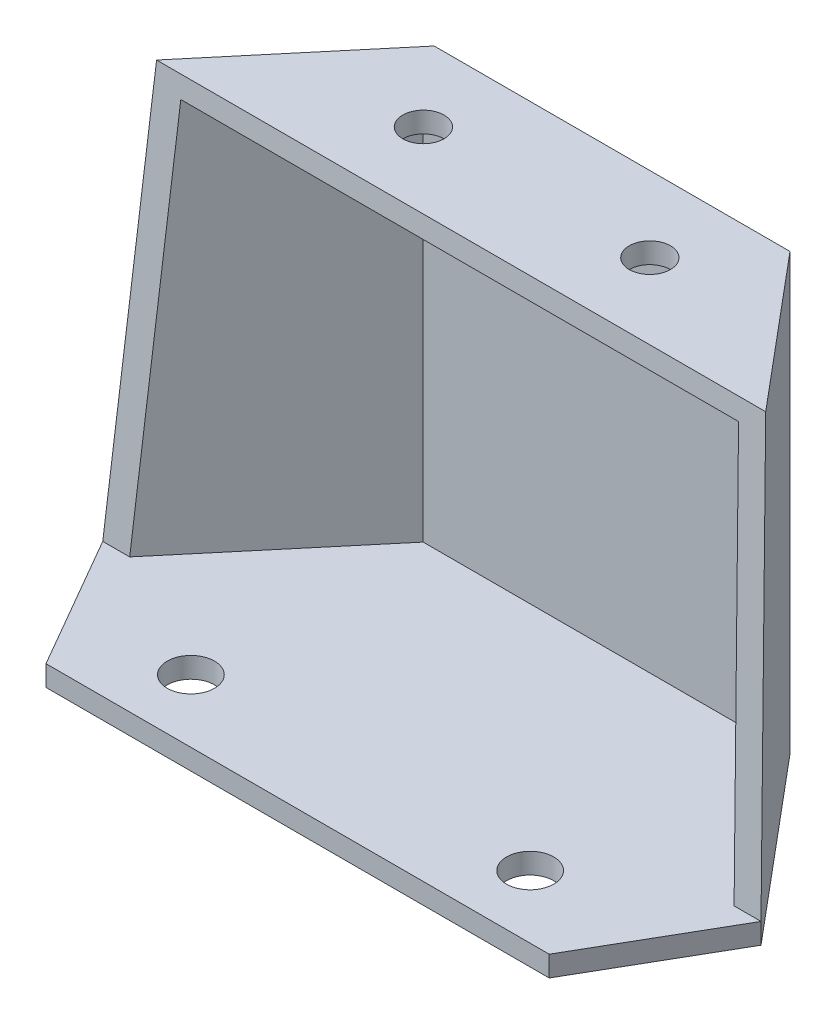
ISO-10303-21;
HEADER;
FILE_DESCRIPTION(('STEP AP214'),'2;1');
FILE_NAME('part.step','',(''),(''),'','','');
FILE_SCHEMA(('AUTOMOTIVE_DESIGN { 1 0 10303 214 1 1 1 1 }'));
ENDSEC;
DATA;
#1=APPLICATION_CONTEXT('core data for automotive mechanical design processes');
#2=APPLICATION_PROTOCOL_DEFINITION('international standard','automotive_design',2000,#1);
#3=PRODUCT_CONTEXT('',#1,'mechanical');
#4=PRODUCT('Part','Part','',(#3));
#5=PRODUCT_RELATED_PRODUCT_CATEGORY('part','',(#4));
#6=PRODUCT_DEFINITION_FORMATION('','',#4);
#7=PRODUCT_DEFINITION_CONTEXT('part definition',#1,'design');
#8=PRODUCT_DEFINITION('design','',#6,#7);
#9=PRODUCT_DEFINITION_SHAPE('','',#8);
#10=(LENGTH_UNIT() NAMED_UNIT(*) SI_UNIT(.MILLI.,.METRE.));
#11=(NAMED_UNIT(*) PLANE_ANGLE_UNIT() SI_UNIT($,.RADIAN.));
#12=(NAMED_UNIT(*) SI_UNIT($,.STERADIAN.) SOLID_ANGLE_UNIT());
#13=UNCERTAINTY_MEASURE_WITH_UNIT(LENGTH_MEASURE(1.E-05),#10,'distance_accuracy_value','');
#14=(GEOMETRIC_REPRESENTATION_CONTEXT(3) GLOBAL_UNCERTAINTY_ASSIGNED_CONTEXT((#13)) GLOBAL_UNIT_ASSIGNED_CONTEXT((#10,
#11,#12)) REPRESENTATION_CONTEXT('',''));
#15=CARTESIAN_POINT('',(0.,0.,0.));
#16=DIRECTION('',(0.,0.,1.));
#17=DIRECTION('',(1.,0.,0.));
#18=AXIS2_PLACEMENT_3D('',#15,#16,#17);
#19=CARTESIAN_POINT('',(-159.592352403094,211.,-65.1118643381918));
#20=DIRECTION('',(0.766044443118977,0.,0.642787609686541));
#21=DIRECTION('',(0.642787609686541,0.,-0.766044443118977));
#22=AXIS2_PLACEMENT_3D('',#19,#20,#21);
#23=PLANE('',#22);
#24=DIRECTION('',(0.,-1.,0.));
#25=VECTOR('',#24,1.);
#26=CARTESIAN_POINT('',(-159.592352403094,211.,-65.1118643381918));
#27=LINE('',#26,#25);
#28=CARTESIAN_POINT('',(-159.592352403094,10.,-65.1118643381918));
#29=VERTEX_POINT('',#28);
#30=CARTESIAN_POINT('',(-159.592352403094,0.,-65.1118643381918));
#31=VERTEX_POINT('',#30);
#32=EDGE_CURVE('E163',#29,#31,#27,.T.);
#33=ORIENTED_EDGE('',*,*,#32,.F.);
#34=DIRECTION('',(0.0589802795117459,0.995781425892182,-0.0702899600003336));
#35=VECTOR('',#34,1.);
#36=CARTESIAN_POINT('',(-147.787327569917,209.307710278525,-79.1805450937942));
#37=LINE('',#36,#35);
#38=CARTESIAN_POINT('',(-147.687093002177,211.,-79.3));
#39=VERTEX_POINT('',#38);
#40=EDGE_CURVE('E133',#29,#39,#37,.T.);
#41=ORIENTED_EDGE('',*,*,#40,.T.);
#42=DIRECTION('',(-0.642787609686541,0.,0.766044443118977));
#43=VECTOR('',#42,1.);
#44=CARTESIAN_POINT('',(-159.592352403094,211.,-65.1118643381918));
#45=LINE('',#44,#43);
#46=CARTESIAN_POINT('',(-86.265,211.,-152.5));
#47=VERTEX_POINT('',#46);
#48=EDGE_CURVE('E213',#47,#39,#45,.T.);
#49=ORIENTED_EDGE('',*,*,#48,.F.);
#50=DIRECTION('',(0.,-1.,0.));
#51=VECTOR('',#50,1.);
#52=CARTESIAN_POINT('',(-86.265,211.,-152.5));
#53=LINE('',#52,#51);
#54=CARTESIAN_POINT('',(-86.265,0.,-152.5));
#55=VERTEX_POINT('',#54);
#56=EDGE_CURVE('E158',#47,#55,#53,.T.);
#57=ORIENTED_EDGE('',*,*,#56,.T.);
#58=DIRECTION('',(-0.642787609686541,0.,0.766044443118977));
#59=VECTOR('',#58,1.);
#60=CARTESIAN_POINT('',(-159.592352403094,0.,-65.1118643381918));
#61=LINE('',#60,#59);
#62=EDGE_CURVE('E212',#55,#31,#61,.T.);
#63=ORIENTED_EDGE('',*,*,#62,.T.);
#64=EDGE_LOOP('',(#33,#41,#49,#57,#63));
#65=FACE_BOUND('',#64,.T.);
#66=ADVANCED_FACE('F39',(#65),#23,.F.);
#67=CARTESIAN_POINT('',(-122.,211.,0.));
#68=DIRECTION('',(0.866025403784438,0.,-0.500000000000001));
#69=DIRECTION('',(-0.500000000000001,0.,-0.866025403784438));
#70=AXIS2_PLACEMENT_3D('',#67,#68,#69);
#71=PLANE('',#70);
#72=DIRECTION('',(0.,-1.,0.));
#73=VECTOR('',#72,1.);
#74=CARTESIAN_POINT('',(-122.,211.,0.));
#75=LINE('',#74,#73);
#76=CARTESIAN_POINT('',(-122.,10.,0.));
#77=VERTEX_POINT('',#76);
#78=CARTESIAN_POINT('',(-122.,0.,0.));
#79=VERTEX_POINT('',#78);
#80=EDGE_CURVE('E155',#77,#79,#75,.T.);
#81=ORIENTED_EDGE('',*,*,#80,.F.);
#82=DIRECTION('',(-0.500000000000001,0.,-0.866025403784438));
#83=VECTOR('',#82,1.);
#84=CARTESIAN_POINT('',(-122.,10.,0.));
#85=LINE('',#84,#83);
#86=EDGE_CURVE('E132',#77,#29,#85,.T.);
#87=ORIENTED_EDGE('',*,*,#86,.T.);
#88=ORIENTED_EDGE('',*,*,#32,.T.);
#89=DIRECTION('',(0.500000000000001,0.,0.866025403784438));
#90=VECTOR('',#89,1.);
#91=CARTESIAN_POINT('',(-122.,0.,0.));
#92=LINE('',#91,#90);
#93=EDGE_CURVE('E222',#31,#79,#92,.T.);
#94=ORIENTED_EDGE('',*,*,#93,.T.);
#95=EDGE_LOOP('',(#81,#87,#88,#94));
#96=FACE_BOUND('',#95,.T.);
#97=ADVANCED_FACE('F246',(#96),#71,.F.);
#98=CARTESIAN_POINT('',(122.,211.,0.));
#99=DIRECTION('',(0.,0.,-1.));
#100=DIRECTION('',(-1.,0.,0.));
#101=AXIS2_PLACEMENT_3D('',#98,#99,#100);
#102=PLANE('',#101);
#103=DIRECTION('',(0.,-1.,0.));
#104=VECTOR('',#103,1.);
#105=CARTESIAN_POINT('',(122.,211.,0.));
#106=LINE('',#105,#104);
#107=CARTESIAN_POINT('',(122.,10.,0.));
#108=VERTEX_POINT('',#107);
#109=CARTESIAN_POINT('',(122.,0.,0.));
#110=VERTEX_POINT('',#109);
#111=EDGE_CURVE('E152',#108,#110,#106,.T.);
#112=ORIENTED_EDGE('',*,*,#111,.F.);
#113=DIRECTION('',(1.,0.,0.));
#114=VECTOR('',#113,1.);
#115=CARTESIAN_POINT('',(-159.592352403094,10.,0.));
#116=LINE('',#115,#114);
#117=EDGE_CURVE('E128',#77,#108,#116,.T.);
#118=ORIENTED_EDGE('',*,*,#117,.F.);
#119=ORIENTED_EDGE('',*,*,#80,.T.);
#120=DIRECTION('',(1.,0.,0.));
#121=VECTOR('',#120,1.);
#122=CARTESIAN_POINT('',(122.,0.,0.));
#123=LINE('',#122,#121);
#124=EDGE_CURVE('E225',#79,#110,#123,.T.);
#125=ORIENTED_EDGE('',*,*,#124,.T.);
#126=EDGE_LOOP('',(#112,#118,#119,#125));
#127=FACE_BOUND('',#126,.T.);
#128=ADVANCED_FACE('F266',(#127),#102,.F.);
#129=CARTESIAN_POINT('',(122.,211.,0.));
#130=DIRECTION('',(-0.866025403784438,0.,-0.500000000000001));
#131=DIRECTION('',(-0.500000000000001,0.,0.866025403784438));
#132=AXIS2_PLACEMENT_3D('',#129,#130,#131);
#133=PLANE('',#132);
#134=DIRECTION('',(0.,-1.,0.));
#135=VECTOR('',#134,1.);
#136=CARTESIAN_POINT('',(159.592352403094,211.,-65.1118643381918));
#137=LINE('',#136,#135);
#138=CARTESIAN_POINT('',(159.592352403094,10.,-65.1118643381918));
#139=VERTEX_POINT('',#138);
#140=CARTESIAN_POINT('',(159.592352403094,0.,-65.1118643381918));
#141=VERTEX_POINT('',#140);
#142=EDGE_CURVE('E143',#139,#141,#137,.T.);
#143=ORIENTED_EDGE('',*,*,#142,.F.);
#144=DIRECTION('',(-0.500000000000001,0.,0.866025403784438));
#145=VECTOR('',#144,1.);
#146=CARTESIAN_POINT('',(122.,10.,0.));
#147=LINE('',#146,#145);
#148=EDGE_CURVE('E123',#139,#108,#147,.T.);
#149=ORIENTED_EDGE('',*,*,#148,.T.);
#150=ORIENTED_EDGE('',*,*,#111,.T.);
#151=DIRECTION('',(0.500000000000001,0.,-0.866025403784438));
#152=VECTOR('',#151,1.);
#153=CARTESIAN_POINT('',(122.,0.,0.));
#154=LINE('',#153,#152);
#155=EDGE_CURVE('E150',#110,#141,#154,.T.);
#156=ORIENTED_EDGE('',*,*,#155,.T.);
#157=EDGE_LOOP('',(#143,#149,#150,#156));
#158=FACE_BOUND('',#157,.T.);
#159=ADVANCED_FACE('F148',(#158),#133,.F.);
#160=CARTESIAN_POINT('',(159.592352403094,211.,-65.1118643381918));
#161=DIRECTION('',(-0.766044443118977,0.,0.642787609686541));
#162=DIRECTION('',(0.642787609686541,0.,0.766044443118977));
#163=AXIS2_PLACEMENT_3D('',#160,#161,#162);
#164=PLANE('',#163);
#165=DIRECTION('',(-0.642787609686541,0.,-0.766044443118977));
#166=VECTOR('',#165,1.);
#167=CARTESIAN_POINT('',(159.592352403094,211.,-65.1118643381918));
#168=LINE('',#167,#166);
#169=CARTESIAN_POINT('',(147.687093002177,211.,-79.3));
#170=VERTEX_POINT('',#169);
#171=CARTESIAN_POINT('',(86.265,211.,-152.5));
#172=VERTEX_POINT('',#171);
#173=EDGE_CURVE('E146',#170,#172,#168,.T.);
#174=ORIENTED_EDGE('',*,*,#173,.F.);
#175=DIRECTION('',(0.0589802795117459,-0.995781425892182,0.0702899600003336));
#176=VECTOR('',#175,1.);
#177=CARTESIAN_POINT('',(147.787327569917,209.307710278525,-79.1805450937942));
#178=LINE('',#177,#176);
#179=EDGE_CURVE('E56',#170,#139,#178,.T.);
#180=ORIENTED_EDGE('',*,*,#179,.T.);
#181=ORIENTED_EDGE('',*,*,#142,.T.);
#182=DIRECTION('',(-0.642787609686541,0.,-0.766044443118977));
#183=VECTOR('',#182,1.);
#184=CARTESIAN_POINT('',(159.592352403094,0.,-65.1118643381918));
#185=LINE('',#184,#183);
#186=CARTESIAN_POINT('',(86.265,0.,-152.5));
#187=VERTEX_POINT('',#186);
#188=EDGE_CURVE('E229',#141,#187,#185,.T.);
#189=ORIENTED_EDGE('',*,*,#188,.T.);
#190=DIRECTION('',(0.,-1.,0.));
#191=VECTOR('',#190,1.);
#192=CARTESIAN_POINT('',(86.265,211.,-152.5));
#193=LINE('',#192,#191);
#194=EDGE_CURVE('E153',#172,#187,#193,.T.);
#195=ORIENTED_EDGE('',*,*,#194,.F.);
#196=EDGE_LOOP('',(#174,#180,#181,#189,#195));
#197=FACE_BOUND('',#196,.T.);
#198=ADVANCED_FACE('F142',(#197),#164,.F.);
#199=CARTESIAN_POINT('',(-86.265,211.,-152.5));
#200=DIRECTION('',(0.,0.,1.));
#201=DIRECTION('',(1.,0.,0.));
#202=AXIS2_PLACEMENT_3D('',#199,#200,#201);
#203=PLANE('',#202);
#204=DIRECTION('',(-1.,0.,0.));
#205=VECTOR('',#204,1.);
#206=CARTESIAN_POINT('',(-86.265,0.,-152.5));
#207=LINE('',#206,#205);
#208=EDGE_CURVE('E216',#187,#55,#207,.T.);
#209=ORIENTED_EDGE('',*,*,#208,.T.);
#210=ORIENTED_EDGE('',*,*,#56,.F.);
#211=DIRECTION('',(-1.,0.,0.));
#212=VECTOR('',#211,1.);
#213=CARTESIAN_POINT('',(-86.265,211.,-152.5));
#214=LINE('',#213,#212);
#215=EDGE_CURVE('E218',#172,#47,#214,.T.);
#216=ORIENTED_EDGE('',*,*,#215,.F.);
#217=ORIENTED_EDGE('',*,*,#194,.T.);
#218=EDGE_LOOP('',(#209,#210,#216,#217));
#219=FACE_BOUND('',#218,.T.);
#220=ADVANCED_FACE('F250',(#219),#203,.F.);
#221=CARTESIAN_POINT('',(0.,211.,0.));
#222=DIRECTION('',(0.,1.,0.));
#223=DIRECTION('',(0.,0.,1.));
#224=AXIS2_PLACEMENT_3D('',#221,#222,#223);
#225=PLANE('',#224);
#226=CARTESIAN_POINT('',(-54.9,211.,-115.9));
#227=DIRECTION('',(0.,1.,0.));
#228=DIRECTION('',(0.,0.,1.));
#229=AXIS2_PLACEMENT_3D('',#226,#227,#228);
#230=CIRCLE('',#229,9.99999999999999);
#231=CARTESIAN_POINT('',(-54.9,211.,-125.9));
#232=VERTEX_POINT('',#231);
#233=EDGE_CURVE('E198',#232,#232,#230,.F.);
#234=ORIENTED_EDGE('',*,*,#233,.T.);
#235=EDGE_LOOP('',(#234));
#236=FACE_BOUND('',#235,.T.);
#237=CARTESIAN_POINT('',(54.9,211.,-115.9));
#238=DIRECTION('',(0.,1.,0.));
#239=DIRECTION('',(0.,0.,1.));
#240=AXIS2_PLACEMENT_3D('',#237,#238,#239);
#241=CIRCLE('',#240,9.99999999999999);
#242=CARTESIAN_POINT('',(54.9,211.,-125.9));
#243=VERTEX_POINT('',#242);
#244=EDGE_CURVE('E182',#243,#243,#241,.F.);
#245=ORIENTED_EDGE('',*,*,#244,.T.);
#246=EDGE_LOOP('',(#245));
#247=FACE_BOUND('',#246,.T.);
#248=DIRECTION('',(1.,0.,0.));
#249=VECTOR('',#248,1.);
#250=CARTESIAN_POINT('',(-159.592352403094,211.,-79.3));
#251=LINE('',#250,#249);
#252=EDGE_CURVE('E201',#39,#170,#251,.T.);
#253=ORIENTED_EDGE('',*,*,#252,.T.);
#254=ORIENTED_EDGE('',*,*,#173,.T.);
#255=ORIENTED_EDGE('',*,*,#215,.T.);
#256=ORIENTED_EDGE('',*,*,#48,.T.);
#257=EDGE_LOOP('',(#253,#254,#255,#256));
#258=FACE_BOUND('',#257,.T.);
#259=ADVANCED_FACE('F249',(#236,#247,#258),#225,.T.);
#260=CARTESIAN_POINT('',(0.,0.,0.));
#261=DIRECTION('',(0.,1.,0.));
#262=DIRECTION('',(0.,0.,1.));
#263=AXIS2_PLACEMENT_3D('',#260,#261,#262);
#264=PLANE('',#263);
#265=CARTESIAN_POINT('',(-82.25,0.,-30.5));
#266=DIRECTION('',(0.,1.,0.));
#267=DIRECTION('',(0.,0.,1.));
#268=AXIS2_PLACEMENT_3D('',#265,#266,#267);
#269=CIRCLE('',#268,11.4510023672373);
#270=CARTESIAN_POINT('',(-82.25,0.,-19.0489976327627));
#271=VERTEX_POINT('',#270);
#272=EDGE_CURVE('E183',#271,#271,#269,.T.);
#273=ORIENTED_EDGE('',*,*,#272,.T.);
#274=EDGE_LOOP('',(#273));
#275=FACE_BOUND('',#274,.T.);
#276=CARTESIAN_POINT('',(82.25,0.,-30.5));
#277=DIRECTION('',(0.,1.,0.));
#278=DIRECTION('',(0.,0.,1.));
#279=AXIS2_PLACEMENT_3D('',#276,#277,#278);
#280=CIRCLE('',#279,11.4510023672373);
#281=CARTESIAN_POINT('',(82.25,0.,-19.0489976327627));
#282=VERTEX_POINT('',#281);
#283=EDGE_CURVE('E189',#282,#282,#280,.T.);
#284=ORIENTED_EDGE('',*,*,#283,.T.);
#285=EDGE_LOOP('',(#284));
#286=FACE_BOUND('',#285,.T.);
#287=ORIENTED_EDGE('',*,*,#62,.F.);
#288=ORIENTED_EDGE('',*,*,#208,.F.);
#289=ORIENTED_EDGE('',*,*,#188,.F.);
#290=ORIENTED_EDGE('',*,*,#155,.F.);
#291=ORIENTED_EDGE('',*,*,#124,.F.);
#292=ORIENTED_EDGE('',*,*,#93,.F.);
#293=EDGE_LOOP('',(#287,#288,#289,#290,#291,#292));
#294=FACE_BOUND('',#293,.T.);
#295=ADVANCED_FACE('F242',(#275,#286,#294),#264,.F.);
#296=CARTESIAN_POINT('',(-159.592352403094,211.,-79.3));
#297=DIRECTION('',(0.,-0.0704125378053743,-0.997517956991154));
#298=DIRECTION('',(0.,0.997517956991155,-0.0704125378053743));
#299=AXIS2_PLACEMENT_3D('',#296,#297,#298);
#300=PLANE('',#299);
#301=DIRECTION('',(1.,0.,0.));
#302=VECTOR('',#301,1.);
#303=CARTESIAN_POINT('',(-159.592352403094,10.,-65.1118643381918));
#304=LINE('',#303,#302);
#305=CARTESIAN_POINT('',(-146.538279509771,10.,-65.1118643381918));
#306=VERTEX_POINT('',#305);
#307=EDGE_CURVE('E138',#29,#306,#304,.T.);
#308=ORIENTED_EDGE('',*,*,#307,.T.);
#309=DIRECTION('',(0.0589802795117459,0.995781425892182,-0.0702899600003336));
#310=VECTOR('',#309,1.);
#311=CARTESIAN_POINT('',(-134.778665532355,208.541025429372,-79.1264265432985));
#312=LINE('',#311,#310);
#313=CARTESIAN_POINT('',(-135.225321571586,201.,-78.5941226038901));
#314=VERTEX_POINT('',#313);
#315=EDGE_CURVE('E63',#306,#314,#312,.T.);
#316=ORIENTED_EDGE('',*,*,#315,.T.);
#317=DIRECTION('',(-1.,0.,0.));
#318=VECTOR('',#317,1.);
#319=CARTESIAN_POINT('',(0.,201.,-78.5941226038901));
#320=LINE('',#319,#318);
#321=CARTESIAN_POINT('',(135.225321571586,201.,-78.5941226038901));
#322=VERTEX_POINT('',#321);
#323=EDGE_CURVE('E202',#322,#314,#320,.T.);
#324=ORIENTED_EDGE('',*,*,#323,.F.);
#325=DIRECTION('',(0.0589802795117459,-0.995781425892182,0.0702899600003336));
#326=VECTOR('',#325,1.);
#327=CARTESIAN_POINT('',(134.778665532355,208.541025429372,-79.1264265432985));
#328=LINE('',#327,#326);
#329=CARTESIAN_POINT('',(146.538279509771,10.,-65.1118643381918));
#330=VERTEX_POINT('',#329);
#331=EDGE_CURVE('E137',#322,#330,#328,.T.);
#332=ORIENTED_EDGE('',*,*,#331,.T.);
#333=EDGE_CURVE('E125',#330,#139,#304,.T.);
#334=ORIENTED_EDGE('',*,*,#333,.T.);
#335=ORIENTED_EDGE('',*,*,#179,.F.);
#336=ORIENTED_EDGE('',*,*,#252,.F.);
#337=ORIENTED_EDGE('',*,*,#40,.F.);
#338=EDGE_LOOP('',(#308,#316,#324,#332,#334,#335,#336,#337));
#339=FACE_BOUND('',#338,.T.);
#340=ADVANCED_FACE('F135',(#339),#300,.F.);
#341=CARTESIAN_POINT('',(-151.931907971904,211.,-58.6839882413264));
#342=DIRECTION('',(0.766044443118977,0.,0.642787609686541));
#343=DIRECTION('',(0.642787609686541,0.,-0.766044443118977));
#344=AXIS2_PLACEMENT_3D('',#341,#342,#343);
#345=PLANE('',#344);
#346=ORIENTED_EDGE('',*,*,#315,.F.);
#347=DIRECTION('',(-0.642787609686541,0.,0.766044443118977));
#348=VECTOR('',#347,1.);
#349=CARTESIAN_POINT('',(-151.931907971904,9.99999999999998,-58.6839882413264));
#350=LINE('',#349,#348);
#351=CARTESIAN_POINT('',(-81.60192341845,10.,-142.5));
#352=VERTEX_POINT('',#351);
#353=EDGE_CURVE('E164',#352,#306,#350,.T.);
#354=ORIENTED_EDGE('',*,*,#353,.F.);
#355=DIRECTION('',(0.,-1.,0.));
#356=VECTOR('',#355,1.);
#357=CARTESIAN_POINT('',(-81.60192341845,211.,-142.5));
#358=LINE('',#357,#356);
#359=CARTESIAN_POINT('',(-81.60192341845,201.,-142.5));
#360=VERTEX_POINT('',#359);
#361=EDGE_CURVE('E177',#360,#352,#358,.T.);
#362=ORIENTED_EDGE('',*,*,#361,.F.);
#363=DIRECTION('',(-0.642787609686541,0.,0.766044443118977));
#364=VECTOR('',#363,1.);
#365=CARTESIAN_POINT('',(-151.931907971904,201.,-58.6839882413264));
#366=LINE('',#365,#364);
#367=EDGE_CURVE('E167',#360,#314,#366,.T.);
#368=ORIENTED_EDGE('',*,*,#367,.T.);
#369=EDGE_LOOP('',(#346,#354,#362,#368));
#370=FACE_BOUND('',#369,.T.);
#371=ADVANCED_FACE('F270',(#370),#345,.T.);
#372=CARTESIAN_POINT('',(151.931907971904,211.,-58.6839882413264));
#373=DIRECTION('',(-0.766044443118977,0.,0.642787609686541));
#374=DIRECTION('',(0.642787609686541,0.,0.766044443118977));
#375=AXIS2_PLACEMENT_3D('',#372,#373,#374);
#376=PLANE('',#375);
#377=ORIENTED_EDGE('',*,*,#331,.F.);
#378=DIRECTION('',(-0.642787609686541,0.,-0.766044443118977));
#379=VECTOR('',#378,1.);
#380=CARTESIAN_POINT('',(151.931907971904,201.,-58.6839882413264));
#381=LINE('',#380,#379);
#382=CARTESIAN_POINT('',(81.60192341845,201.,-142.5));
#383=VERTEX_POINT('',#382);
#384=EDGE_CURVE('E48',#322,#383,#381,.T.);
#385=ORIENTED_EDGE('',*,*,#384,.T.);
#386=DIRECTION('',(0.,-1.,0.));
#387=VECTOR('',#386,1.);
#388=CARTESIAN_POINT('',(81.60192341845,211.,-142.5));
#389=LINE('',#388,#387);
#390=CARTESIAN_POINT('',(81.60192341845,10.,-142.5));
#391=VERTEX_POINT('',#390);
#392=EDGE_CURVE('E170',#383,#391,#389,.T.);
#393=ORIENTED_EDGE('',*,*,#392,.T.);
#394=DIRECTION('',(-0.642787609686541,0.,-0.766044443118977));
#395=VECTOR('',#394,1.);
#396=CARTESIAN_POINT('',(151.931907971904,9.99999999999998,-58.6839882413264));
#397=LINE('',#396,#395);
#398=EDGE_CURVE('E175',#330,#391,#397,.T.);
#399=ORIENTED_EDGE('',*,*,#398,.F.);
#400=EDGE_LOOP('',(#377,#385,#393,#399));
#401=FACE_BOUND('',#400,.T.);
#402=ADVANCED_FACE('F273',(#401),#376,.T.);
#403=CARTESIAN_POINT('',(-86.265,211.,-142.5));
#404=DIRECTION('',(0.,0.,1.));
#405=DIRECTION('',(1.,0.,0.));
#406=AXIS2_PLACEMENT_3D('',#403,#404,#405);
#407=PLANE('',#406);
#408=DIRECTION('',(-1.,0.,0.));
#409=VECTOR('',#408,1.);
#410=CARTESIAN_POINT('',(-86.265,10.,-142.5));
#411=LINE('',#410,#409);
#412=EDGE_CURVE('E173',#391,#352,#411,.T.);
#413=ORIENTED_EDGE('',*,*,#412,.F.);
#414=ORIENTED_EDGE('',*,*,#392,.F.);
#415=DIRECTION('',(-1.,0.,0.));
#416=VECTOR('',#415,1.);
#417=CARTESIAN_POINT('',(-86.265,201.,-142.5));
#418=LINE('',#417,#416);
#419=EDGE_CURVE('E11',#383,#360,#418,.T.);
#420=ORIENTED_EDGE('',*,*,#419,.T.);
#421=ORIENTED_EDGE('',*,*,#361,.T.);
#422=EDGE_LOOP('',(#413,#414,#420,#421));
#423=FACE_BOUND('',#422,.T.);
#424=ADVANCED_FACE('F277',(#423),#407,.T.);
#425=CARTESIAN_POINT('',(0.,201.,0.));
#426=DIRECTION('',(0.,1.,0.));
#427=DIRECTION('',(0.,0.,1.));
#428=AXIS2_PLACEMENT_3D('',#425,#426,#427);
#429=PLANE('',#428);
#430=CARTESIAN_POINT('',(-54.9,201.,-115.9));
#431=DIRECTION('',(0.,1.,0.));
#432=DIRECTION('',(0.,0.,1.));
#433=AXIS2_PLACEMENT_3D('',#430,#431,#432);
#434=CIRCLE('',#433,9.99999999999999);
#435=CARTESIAN_POINT('',(-54.9,201.,-125.9));
#436=VERTEX_POINT('',#435);
#437=EDGE_CURVE('E43',#436,#436,#434,.F.);
#438=ORIENTED_EDGE('',*,*,#437,.F.);
#439=EDGE_LOOP('',(#438));
#440=FACE_BOUND('',#439,.T.);
#441=CARTESIAN_POINT('',(54.9,201.,-115.9));
#442=DIRECTION('',(0.,1.,0.));
#443=DIRECTION('',(0.,0.,1.));
#444=AXIS2_PLACEMENT_3D('',#441,#442,#443);
#445=CIRCLE('',#444,9.99999999999999);
#446=CARTESIAN_POINT('',(54.9,201.,-125.9));
#447=VERTEX_POINT('',#446);
#448=EDGE_CURVE('E180',#447,#447,#445,.F.);
#449=ORIENTED_EDGE('',*,*,#448,.F.);
#450=EDGE_LOOP('',(#449));
#451=FACE_BOUND('',#450,.T.);
#452=ORIENTED_EDGE('',*,*,#384,.F.);
#453=ORIENTED_EDGE('',*,*,#323,.T.);
#454=ORIENTED_EDGE('',*,*,#367,.F.);
#455=ORIENTED_EDGE('',*,*,#419,.F.);
#456=EDGE_LOOP('',(#452,#453,#454,#455));
#457=FACE_BOUND('',#456,.T.);
#458=ADVANCED_FACE('F280',(#440,#451,#457),#429,.F.);
#459=CARTESIAN_POINT('',(0.,10.,0.));
#460=DIRECTION('',(0.,1.,0.));
#461=DIRECTION('',(0.,0.,1.));
#462=AXIS2_PLACEMENT_3D('',#459,#460,#461);
#463=PLANE('',#462);
#464=CARTESIAN_POINT('',(-82.25,10.,-30.5));
#465=DIRECTION('',(0.,1.,0.));
#466=DIRECTION('',(0.,0.,1.));
#467=AXIS2_PLACEMENT_3D('',#464,#465,#466);
#468=CIRCLE('',#467,11.4510023672373);
#469=CARTESIAN_POINT('',(-82.25,10.,-19.0489976327627));
#470=VERTEX_POINT('',#469);
#471=EDGE_CURVE('E194',#470,#470,#468,.T.);
#472=ORIENTED_EDGE('',*,*,#471,.F.);
#473=EDGE_LOOP('',(#472));
#474=FACE_BOUND('',#473,.T.);
#475=CARTESIAN_POINT('',(82.25,10.,-30.5));
#476=DIRECTION('',(0.,1.,0.));
#477=DIRECTION('',(0.,0.,1.));
#478=AXIS2_PLACEMENT_3D('',#475,#476,#477);
#479=CIRCLE('',#478,11.4510023672373);
#480=CARTESIAN_POINT('',(82.25,10.,-19.0489976327627));
#481=VERTEX_POINT('',#480);
#482=EDGE_CURVE('E466',#481,#481,#479,.T.);
#483=ORIENTED_EDGE('',*,*,#482,.F.);
#484=EDGE_LOOP('',(#483));
#485=FACE_BOUND('',#484,.T.);
#486=ORIENTED_EDGE('',*,*,#353,.T.);
#487=ORIENTED_EDGE('',*,*,#307,.F.);
#488=ORIENTED_EDGE('',*,*,#86,.F.);
#489=ORIENTED_EDGE('',*,*,#117,.T.);
#490=ORIENTED_EDGE('',*,*,#148,.F.);
#491=ORIENTED_EDGE('',*,*,#333,.F.);
#492=ORIENTED_EDGE('',*,*,#398,.T.);
#493=ORIENTED_EDGE('',*,*,#412,.T.);
#494=EDGE_LOOP('',(#486,#487,#488,#489,#490,#491,#492,#493));
#495=FACE_BOUND('',#494,.T.);
#496=ADVANCED_FACE('F41',(#474,#485,#495),#463,.T.);
#497=CARTESIAN_POINT('',(54.9,211.000012,-115.9));
#498=DIRECTION('',(0.,-1.,0.));
#499=DIRECTION('',(0.,0.,-1.));
#500=AXIS2_PLACEMENT_3D('',#497,#498,#499);
#501=CYLINDRICAL_SURFACE('',#500,9.99999999999999);
#502=CARTESIAN_POINT('',(54.9,211.,-125.9));
#503=CARTESIAN_POINT('',(54.9,210.895833333333,-125.9));
#504=CARTESIAN_POINT('',(54.9,210.791666666667,-125.9));
#505=CARTESIAN_POINT('',(54.9,210.583333333333,-125.9));
#506=CARTESIAN_POINT('',(54.9,210.479166666667,-125.9));
#507=CARTESIAN_POINT('',(54.9,210.270833333333,-125.9));
#508=CARTESIAN_POINT('',(54.9,210.166666666667,-125.9));
#509=CARTESIAN_POINT('',(54.9,209.958333333333,-125.9));
#510=CARTESIAN_POINT('',(54.9,209.854166666667,-125.9));
#511=CARTESIAN_POINT('',(54.9,209.645833333333,-125.9));
#512=CARTESIAN_POINT('',(54.9,209.541666666667,-125.9));
#513=CARTESIAN_POINT('',(54.9,209.333333333333,-125.9));
#514=CARTESIAN_POINT('',(54.9,209.229166666667,-125.9));
#515=CARTESIAN_POINT('',(54.9,209.020833333333,-125.9));
#516=CARTESIAN_POINT('',(54.9,208.916666666667,-125.9));
#517=CARTESIAN_POINT('',(54.9,208.708333333333,-125.9));
#518=CARTESIAN_POINT('',(54.9,208.604166666667,-125.9));
#519=CARTESIAN_POINT('',(54.9,208.395833333333,-125.9));
#520=CARTESIAN_POINT('',(54.9,208.291666666667,-125.9));
#521=CARTESIAN_POINT('',(54.9,208.083333333333,-125.9));
#522=CARTESIAN_POINT('',(54.9,207.979166666667,-125.9));
#523=CARTESIAN_POINT('',(54.9,207.770833333333,-125.9));
#524=CARTESIAN_POINT('',(54.9,207.666666666667,-125.9));
#525=CARTESIAN_POINT('',(54.9,207.458333333333,-125.9));
#526=CARTESIAN_POINT('',(54.9,207.354166666667,-125.9));
#527=CARTESIAN_POINT('',(54.9,207.145833333333,-125.9));
#528=CARTESIAN_POINT('',(54.9,207.041666666667,-125.9));
#529=CARTESIAN_POINT('',(54.9,206.833333333333,-125.9));
#530=CARTESIAN_POINT('',(54.9,206.729166666667,-125.9));
#531=CARTESIAN_POINT('',(54.9,206.520833333333,-125.9));
#532=CARTESIAN_POINT('',(54.9,206.416666666667,-125.9));
#533=CARTESIAN_POINT('',(54.9,206.208333333333,-125.9));
#534=CARTESIAN_POINT('',(54.9,206.104166666667,-125.9));
#535=CARTESIAN_POINT('',(54.9,205.895833333333,-125.9));
#536=CARTESIAN_POINT('',(54.9,205.791666666667,-125.9));
#537=CARTESIAN_POINT('',(54.9,205.583333333333,-125.9));
#538=CARTESIAN_POINT('',(54.9,205.479166666667,-125.9));
#539=CARTESIAN_POINT('',(54.9,205.270833333333,-125.9));
#540=CARTESIAN_POINT('',(54.9,205.166666666667,-125.9));
#541=CARTESIAN_POINT('',(54.9,204.958333333333,-125.9));
#542=CARTESIAN_POINT('',(54.9,204.854166666667,-125.9));
#543=CARTESIAN_POINT('',(54.9,204.645833333333,-125.9));
#544=CARTESIAN_POINT('',(54.9,204.541666666667,-125.9));
#545=CARTESIAN_POINT('',(54.9,204.333333333333,-125.9));
#546=CARTESIAN_POINT('',(54.9,204.229166666667,-125.9));
#547=CARTESIAN_POINT('',(54.9,204.020833333333,-125.9));
#548=CARTESIAN_POINT('',(54.9,203.916666666667,-125.9));
#549=CARTESIAN_POINT('',(54.9,203.708333333333,-125.9));
#550=CARTESIAN_POINT('',(54.9,203.604166666667,-125.9));
#551=CARTESIAN_POINT('',(54.9,203.395833333333,-125.9));
#552=CARTESIAN_POINT('',(54.9,203.291666666667,-125.9));
#553=CARTESIAN_POINT('',(54.9,203.083333333333,-125.9));
#554=CARTESIAN_POINT('',(54.9,202.979166666667,-125.9));
#555=CARTESIAN_POINT('',(54.9,202.770833333333,-125.9));
#556=CARTESIAN_POINT('',(54.9,202.666666666667,-125.9));
#557=CARTESIAN_POINT('',(54.9,202.458333333333,-125.9));
#558=CARTESIAN_POINT('',(54.9,202.354166666667,-125.9));
#559=CARTESIAN_POINT('',(54.9,202.145833333333,-125.9));
#560=CARTESIAN_POINT('',(54.9,202.041666666667,-125.9));
#561=CARTESIAN_POINT('',(54.9,201.833333333333,-125.9));
#562=CARTESIAN_POINT('',(54.9,201.729166666667,-125.9));
#563=CARTESIAN_POINT('',(54.9,201.520833333333,-125.9));
#564=CARTESIAN_POINT('',(54.9,201.416666666667,-125.9));
#565=CARTESIAN_POINT('',(54.9,201.208333333333,-125.9));
#566=CARTESIAN_POINT('',(54.9,201.104166666667,-125.9));
#567=CARTESIAN_POINT('',(54.9,201.,-125.9));
#568=B_SPLINE_CURVE_WITH_KNOTS('',3,(#502,#503,#504,#505,#506,#507,#508,#509,#510,#511,#512,
#513,#514,#515,#516,#517,#518,#519,#520,#521,#522,#523,#524,#525,#526,#527,#528,#529,#530,#531,
#532,#533,#534,#535,#536,#537,#538,#539,#540,#541,#542,#543,#544,#545,#546,#547,#548,#549,#550,
#551,#552,#553,#554,#555,#556,#557,#558,#559,#560,#561,#562,#563,#564,#565,#566,#567),
.UNSPECIFIED.,.F.,.F.,(4,2,2,2,2,2,2,2,2,2,2,2,2,2,2,2,2,2,2,2,2,2,2,2,2,2,2,2,2,2,2,2,4),(0.,
0.312500000000021,0.625000000000014,0.937500000000008,1.25,1.56250000000002,1.87500000000002,
2.18750000000001,2.5,2.81250000000002,3.12500000000002,3.43750000000001,3.75,4.06250000000002,
4.37500000000002,4.68750000000001,5.,5.31250000000003,5.62500000000002,5.93750000000001,
6.25000000000001,6.56250000000003,6.87500000000002,7.18750000000001,7.50000000000001,
7.81250000000003,8.12500000000002,8.43750000000001,8.75000000000001,9.06250000000003,
9.37500000000002,9.68750000000002,10.),.UNSPECIFIED.);
#569=EDGE_CURVE('BSEAM287',#243,#447,#568,.T.);
#570=ORIENTED_EDGE('',*,*,#244,.F.);
#571=ORIENTED_EDGE('',*,*,#448,.T.);
#572=ORIENTED_EDGE('',*,*,#569,.T.);
#573=ORIENTED_EDGE('',*,*,#569,.F.);
#574=EDGE_LOOP('',(#570,#572,#571,#573));
#575=FACE_BOUND('',#574,.T.);
#576=ADVANCED_FACE('F287',(#575),#501,.F.);
#577=CARTESIAN_POINT('',(-54.9,211.000012,-115.9));
#578=DIRECTION('',(0.,-1.,0.));
#579=DIRECTION('',(0.,0.,-1.));
#580=AXIS2_PLACEMENT_3D('',#577,#578,#579);
#581=CYLINDRICAL_SURFACE('',#580,9.99999999999999);
#582=CARTESIAN_POINT('',(-54.9,211.,-125.9));
#583=CARTESIAN_POINT('',(-54.9,210.895833333333,-125.9));
#584=CARTESIAN_POINT('',(-54.9,210.791666666667,-125.9));
#585=CARTESIAN_POINT('',(-54.9,210.583333333333,-125.9));
#586=CARTESIAN_POINT('',(-54.9,210.479166666667,-125.9));
#587=CARTESIAN_POINT('',(-54.9,210.270833333333,-125.9));
#588=CARTESIAN_POINT('',(-54.9,210.166666666667,-125.9));
#589=CARTESIAN_POINT('',(-54.9,209.958333333333,-125.9));
#590=CARTESIAN_POINT('',(-54.9,209.854166666667,-125.9));
#591=CARTESIAN_POINT('',(-54.9,209.645833333333,-125.9));
#592=CARTESIAN_POINT('',(-54.9,209.541666666667,-125.9));
#593=CARTESIAN_POINT('',(-54.9,209.333333333333,-125.9));
#594=CARTESIAN_POINT('',(-54.9,209.229166666667,-125.9));
#595=CARTESIAN_POINT('',(-54.9,209.020833333333,-125.9));
#596=CARTESIAN_POINT('',(-54.9,208.916666666667,-125.9));
#597=CARTESIAN_POINT('',(-54.9,208.708333333333,-125.9));
#598=CARTESIAN_POINT('',(-54.9,208.604166666667,-125.9));
#599=CARTESIAN_POINT('',(-54.9,208.395833333333,-125.9));
#600=CARTESIAN_POINT('',(-54.9,208.291666666667,-125.9));
#601=CARTESIAN_POINT('',(-54.9,208.083333333333,-125.9));
#602=CARTESIAN_POINT('',(-54.9,207.979166666667,-125.9));
#603=CARTESIAN_POINT('',(-54.9,207.770833333333,-125.9));
#604=CARTESIAN_POINT('',(-54.9,207.666666666667,-125.9));
#605=CARTESIAN_POINT('',(-54.9,207.458333333333,-125.9));
#606=CARTESIAN_POINT('',(-54.9,207.354166666667,-125.9));
#607=CARTESIAN_POINT('',(-54.9,207.145833333333,-125.9));
#608=CARTESIAN_POINT('',(-54.9,207.041666666667,-125.9));
#609=CARTESIAN_POINT('',(-54.9,206.833333333333,-125.9));
#610=CARTESIAN_POINT('',(-54.9,206.729166666667,-125.9));
#611=CARTESIAN_POINT('',(-54.9,206.520833333333,-125.9));
#612=CARTESIAN_POINT('',(-54.9,206.416666666667,-125.9));
#613=CARTESIAN_POINT('',(-54.9,206.208333333333,-125.9));
#614=CARTESIAN_POINT('',(-54.9,206.104166666667,-125.9));
#615=CARTESIAN_POINT('',(-54.9,205.895833333333,-125.9));
#616=CARTESIAN_POINT('',(-54.9,205.791666666667,-125.9));
#617=CARTESIAN_POINT('',(-54.9,205.583333333333,-125.9));
#618=CARTESIAN_POINT('',(-54.9,205.479166666667,-125.9));
#619=CARTESIAN_POINT('',(-54.9,205.270833333333,-125.9));
#620=CARTESIAN_POINT('',(-54.9,205.166666666667,-125.9));
#621=CARTESIAN_POINT('',(-54.9,204.958333333333,-125.9));
#622=CARTESIAN_POINT('',(-54.9,204.854166666667,-125.9));
#623=CARTESIAN_POINT('',(-54.9,204.645833333333,-125.9));
#624=CARTESIAN_POINT('',(-54.9,204.541666666667,-125.9));
#625=CARTESIAN_POINT('',(-54.9,204.333333333333,-125.9));
#626=CARTESIAN_POINT('',(-54.9,204.229166666667,-125.9));
#627=CARTESIAN_POINT('',(-54.9,204.020833333333,-125.9));
#628=CARTESIAN_POINT('',(-54.9,203.916666666667,-125.9));
#629=CARTESIAN_POINT('',(-54.9,203.708333333333,-125.9));
#630=CARTESIAN_POINT('',(-54.9,203.604166666667,-125.9));
#631=CARTESIAN_POINT('',(-54.9,203.395833333333,-125.9));
#632=CARTESIAN_POINT('',(-54.9,203.291666666667,-125.9));
#633=CARTESIAN_POINT('',(-54.9,203.083333333333,-125.9));
#634=CARTESIAN_POINT('',(-54.9,202.979166666667,-125.9));
#635=CARTESIAN_POINT('',(-54.9,202.770833333333,-125.9));
#636=CARTESIAN_POINT('',(-54.9,202.666666666667,-125.9));
#637=CARTESIAN_POINT('',(-54.9,202.458333333333,-125.9));
#638=CARTESIAN_POINT('',(-54.9,202.354166666667,-125.9));
#639=CARTESIAN_POINT('',(-54.9,202.145833333333,-125.9));
#640=CARTESIAN_POINT('',(-54.9,202.041666666667,-125.9));
#641=CARTESIAN_POINT('',(-54.9,201.833333333333,-125.9));
#642=CARTESIAN_POINT('',(-54.9,201.729166666667,-125.9));
#643=CARTESIAN_POINT('',(-54.9,201.520833333333,-125.9));
#644=CARTESIAN_POINT('',(-54.9,201.416666666667,-125.9));
#645=CARTESIAN_POINT('',(-54.9,201.208333333333,-125.9));
#646=CARTESIAN_POINT('',(-54.9,201.104166666667,-125.9));
#647=CARTESIAN_POINT('',(-54.9,201.,-125.9));
#648=B_SPLINE_CURVE_WITH_KNOTS('',3,(#582,#583,#584,#585,#586,#587,#588,#589,#590,#591,#592,
#593,#594,#595,#596,#597,#598,#599,#600,#601,#602,#603,#604,#605,#606,#607,#608,#609,#610,#611,
#612,#613,#614,#615,#616,#617,#618,#619,#620,#621,#622,#623,#624,#625,#626,#627,#628,#629,#630,
#631,#632,#633,#634,#635,#636,#637,#638,#639,#640,#641,#642,#643,#644,#645,#646,#647),
.UNSPECIFIED.,.F.,.F.,(4,2,2,2,2,2,2,2,2,2,2,2,2,2,2,2,2,2,2,2,2,2,2,2,2,2,2,2,2,2,2,2,4),(0.,
0.312500000000021,0.625000000000014,0.937500000000008,1.25,1.56250000000002,1.87500000000002,
2.18750000000001,2.5,2.81250000000002,3.12500000000002,3.43750000000001,3.75,4.06250000000002,
4.37500000000002,4.68750000000001,5.,5.31250000000003,5.62500000000002,5.93750000000001,
6.25000000000001,6.56250000000003,6.87500000000002,7.18750000000001,7.50000000000001,
7.81250000000003,8.12500000000002,8.43750000000001,8.75000000000001,9.06250000000003,
9.37500000000002,9.68750000000002,10.),.UNSPECIFIED.);
#649=EDGE_CURVE('BSEAM363',#232,#436,#648,.T.);
#650=ORIENTED_EDGE('',*,*,#233,.F.);
#651=ORIENTED_EDGE('',*,*,#437,.T.);
#652=ORIENTED_EDGE('',*,*,#649,.T.);
#653=ORIENTED_EDGE('',*,*,#649,.F.);
#654=EDGE_LOOP('',(#650,#652,#651,#653));
#655=FACE_BOUND('',#654,.T.);
#656=ADVANCED_FACE('F363',(#655),#581,.F.);
#657=CARTESIAN_POINT('',(82.25,-30.,-30.5));
#658=DIRECTION('',(0.,1.,0.));
#659=DIRECTION('',(0.,0.,1.));
#660=AXIS2_PLACEMENT_3D('',#657,#658,#659);
#661=CYLINDRICAL_SURFACE('',#660,11.4510023672373);
#662=ORIENTED_EDGE('',*,*,#482,.T.);
#663=EDGE_LOOP('',(#662));
#664=FACE_BOUND('',#663,.T.);
#665=ORIENTED_EDGE('',*,*,#283,.F.);
#666=EDGE_LOOP('',(#665));
#667=FACE_BOUND('',#666,.T.);
#668=ADVANCED_FACE('F374',(#664,#667),#661,.F.);
#669=CARTESIAN_POINT('',(-82.25,-30.,-30.5));
#670=DIRECTION('',(0.,1.,0.));
#671=DIRECTION('',(0.,0.,1.));
#672=AXIS2_PLACEMENT_3D('',#669,#670,#671);
#673=CYLINDRICAL_SURFACE('',#672,11.4510023672373);
#674=ORIENTED_EDGE('',*,*,#471,.T.);
#675=EDGE_LOOP('',(#674));
#676=FACE_BOUND('',#675,.T.);
#677=ORIENTED_EDGE('',*,*,#272,.F.);
#678=EDGE_LOOP('',(#677));
#679=FACE_BOUND('',#678,.T.);
#680=ADVANCED_FACE('F396',(#676,#679),#673,.F.);
#681=CLOSED_SHELL('',(#66,#97,#128,#159,#198,#220,#259,#295,#340,#371,#402,#424,#458,#496,#576,
#656,#668,#680));
#682=MANIFOLD_SOLID_BREP('B2',#681);
#683=ADVANCED_BREP_SHAPE_REPRESENTATION('',(#18,#682),#14);
#684=SHAPE_DEFINITION_REPRESENTATION(#9,#683);
ENDSEC;
END-ISO-10303-21;
